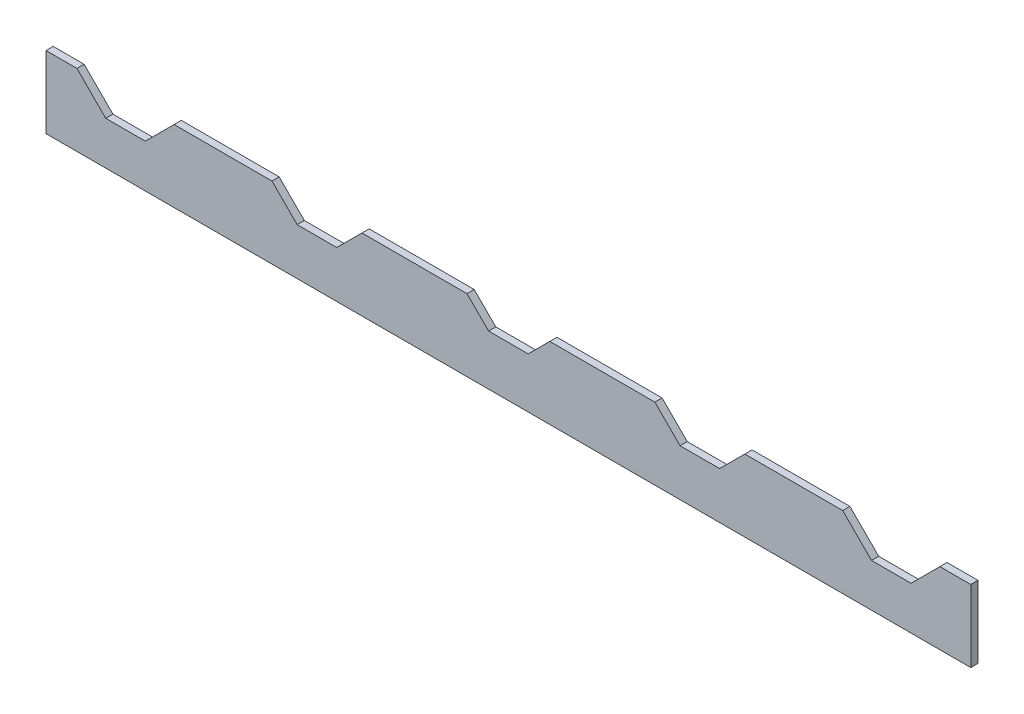
ISO-10303-21;
HEADER;
FILE_DESCRIPTION(('STEP AP214'),'2;1');
FILE_NAME('part.step','',(''),(''),'','','');
FILE_SCHEMA(('AUTOMOTIVE_DESIGN { 1 0 10303 214 1 1 1 1 }'));
ENDSEC;
DATA;
#1=APPLICATION_CONTEXT('core data for automotive mechanical design processes');
#2=APPLICATION_PROTOCOL_DEFINITION('international standard','automotive_design',2000,#1);
#3=PRODUCT_CONTEXT('',#1,'mechanical');
#4=PRODUCT('Part','Part','',(#3));
#5=PRODUCT_RELATED_PRODUCT_CATEGORY('part','',(#4));
#6=PRODUCT_DEFINITION_FORMATION('','',#4);
#7=PRODUCT_DEFINITION_CONTEXT('part definition',#1,'design');
#8=PRODUCT_DEFINITION('design','',#6,#7);
#9=PRODUCT_DEFINITION_SHAPE('','',#8);
#10=(LENGTH_UNIT() NAMED_UNIT(*) SI_UNIT(.MILLI.,.METRE.));
#11=(NAMED_UNIT(*) PLANE_ANGLE_UNIT() SI_UNIT($,.RADIAN.));
#12=(NAMED_UNIT(*) SI_UNIT($,.STERADIAN.) SOLID_ANGLE_UNIT());
#13=UNCERTAINTY_MEASURE_WITH_UNIT(LENGTH_MEASURE(1.E-05),#10,'distance_accuracy_value','');
#14=(GEOMETRIC_REPRESENTATION_CONTEXT(3) GLOBAL_UNCERTAINTY_ASSIGNED_CONTEXT((#13)) GLOBAL_UNIT_ASSIGNED_CONTEXT((#10,
#11,#12)) REPRESENTATION_CONTEXT('',''));
#15=CARTESIAN_POINT('',(0.,0.,0.));
#16=DIRECTION('',(0.,0.,1.));
#17=DIRECTION('',(1.,0.,0.));
#18=AXIS2_PLACEMENT_3D('',#15,#16,#17);
#19=CARTESIAN_POINT('',(-642.5,100.,10.));
#20=DIRECTION('',(0.,-1.,0.));
#21=DIRECTION('',(0.,0.,-1.));
#22=AXIS2_PLACEMENT_3D('',#19,#20,#21);
#23=PLANE('',#22);
#24=DIRECTION('',(0.,0.,1.));
#25=VECTOR('',#24,1.);
#26=CARTESIAN_POINT('',(328.5,100.,-0.000999999999999265));
#27=LINE('',#26,#25);
#28=CARTESIAN_POINT('',(328.5,100.,0.));
#29=VERTEX_POINT('',#28);
#30=CARTESIAN_POINT('',(328.5,100.,10.));
#31=VERTEX_POINT('',#30);
#32=EDGE_CURVE('E227',#29,#31,#27,.T.);
#33=ORIENTED_EDGE('',*,*,#32,.T.);
#34=DIRECTION('',(-1.,0.,0.));
#35=VECTOR('',#34,1.);
#36=CARTESIAN_POINT('',(-642.5,100.,10.));
#37=LINE('',#36,#35);
#38=CARTESIAN_POINT('',(464.5,100.,10.));
#39=VERTEX_POINT('',#38);
#40=EDGE_CURVE('E241',#39,#31,#37,.T.);
#41=ORIENTED_EDGE('',*,*,#40,.F.);
#42=DIRECTION('',(0.,0.,-1.));
#43=VECTOR('',#42,1.);
#44=CARTESIAN_POINT('',(464.5,100.,-0.000999999999999265));
#45=LINE('',#44,#43);
#46=CARTESIAN_POINT('',(464.5,100.,0.));
#47=VERTEX_POINT('',#46);
#48=EDGE_CURVE('E446',#39,#47,#45,.T.);
#49=ORIENTED_EDGE('',*,*,#48,.T.);
#50=DIRECTION('',(-1.,0.,0.));
#51=VECTOR('',#50,1.);
#52=CARTESIAN_POINT('',(-642.5,100.,0.));
#53=LINE('',#52,#51);
#54=EDGE_CURVE('E243',#47,#29,#53,.T.);
#55=ORIENTED_EDGE('',*,*,#54,.T.);
#56=EDGE_LOOP('',(#33,#41,#49,#55));
#57=FACE_BOUND('',#56,.T.);
#58=ADVANCED_FACE('F45',(#57),#23,.F.);
#59=DIRECTION('',(0.,0.,-1.));
#60=VECTOR('',#59,1.);
#61=CARTESIAN_POINT('',(203.5,100.,-0.000999999999999265));
#62=LINE('',#61,#60);
#63=CARTESIAN_POINT('',(203.5,100.,10.));
#64=VERTEX_POINT('',#63);
#65=CARTESIAN_POINT('',(203.5,100.,0.));
#66=VERTEX_POINT('',#65);
#67=EDGE_CURVE('E245',#64,#66,#62,.T.);
#68=ORIENTED_EDGE('',*,*,#67,.T.);
#69=CARTESIAN_POINT('',(57.4999999999999,100.,0.));
#70=VERTEX_POINT('',#69);
#71=EDGE_CURVE('E466',#66,#70,#53,.T.);
#72=ORIENTED_EDGE('',*,*,#71,.T.);
#73=DIRECTION('',(0.,0.,-1.));
#74=VECTOR('',#73,1.);
#75=CARTESIAN_POINT('',(57.4999999999999,100.,-0.000999999999999265));
#76=LINE('',#75,#74);
#77=CARTESIAN_POINT('',(57.5,100.,10.));
#78=VERTEX_POINT('',#77);
#79=EDGE_CURVE('E356',#78,#70,#76,.T.);
#80=ORIENTED_EDGE('',*,*,#79,.F.);
#81=EDGE_CURVE('E254',#64,#78,#37,.T.);
#82=ORIENTED_EDGE('',*,*,#81,.F.);
#83=EDGE_LOOP('',(#68,#72,#80,#82));
#84=FACE_BOUND('',#83,.T.);
#85=ADVANCED_FACE('F519',(#84),#23,.F.);
#86=DIRECTION('',(0.,0.,1.));
#87=VECTOR('',#86,1.);
#88=CARTESIAN_POINT('',(599.5,100.,-0.000999999999999265));
#89=LINE('',#88,#87);
#90=CARTESIAN_POINT('',(599.5,100.,0.));
#91=VERTEX_POINT('',#90);
#92=CARTESIAN_POINT('',(599.5,100.,10.));
#93=VERTEX_POINT('',#92);
#94=EDGE_CURVE('E448',#91,#93,#89,.T.);
#95=ORIENTED_EDGE('',*,*,#94,.T.);
#96=CARTESIAN_POINT('',(642.5,100.,10.));
#97=VERTEX_POINT('',#96);
#98=EDGE_CURVE('E253',#97,#93,#37,.T.);
#99=ORIENTED_EDGE('',*,*,#98,.F.);
#100=DIRECTION('',(0.,0.,-1.));
#101=VECTOR('',#100,1.);
#102=CARTESIAN_POINT('',(642.5,100.,10.));
#103=LINE('',#102,#101);
#104=CARTESIAN_POINT('',(642.5,100.,0.));
#105=VERTEX_POINT('',#104);
#106=EDGE_CURVE('E498',#97,#105,#103,.T.);
#107=ORIENTED_EDGE('',*,*,#106,.T.);
#108=EDGE_CURVE('E409',#105,#91,#53,.T.);
#109=ORIENTED_EDGE('',*,*,#108,.T.);
#110=EDGE_LOOP('',(#95,#99,#107,#109));
#111=FACE_BOUND('',#110,.T.);
#112=ADVANCED_FACE('F503',(#111),#23,.F.);
#113=CARTESIAN_POINT('',(0.,0.,10.));
#114=DIRECTION('',(0.,0.,-1.));
#115=DIRECTION('',(-1.,0.,0.));
#116=AXIS2_PLACEMENT_3D('',#113,#114,#115);
#117=PLANE('',#116);
#118=DIRECTION('',(-0.707106781186546,-0.707106781186548,0.));
#119=VECTOR('',#118,1.);
#120=CARTESIAN_POINT('',(348.5,120.,10.));
#121=LINE('',#120,#119);
#122=CARTESIAN_POINT('',(293.5,65.,10.));
#123=VERTEX_POINT('',#122);
#124=EDGE_CURVE('E224',#31,#123,#121,.T.);
#125=ORIENTED_EDGE('',*,*,#124,.T.);
#126=DIRECTION('',(-1.,0.,0.));
#127=VECTOR('',#126,1.);
#128=CARTESIAN_POINT('',(293.5,65.,10.));
#129=LINE('',#128,#127);
#130=CARTESIAN_POINT('',(238.5,65.,10.));
#131=VERTEX_POINT('',#130);
#132=EDGE_CURVE('E235',#123,#131,#129,.T.);
#133=ORIENTED_EDGE('',*,*,#132,.T.);
#134=DIRECTION('',(-0.707106781186547,0.707106781186548,0.));
#135=VECTOR('',#134,1.);
#136=CARTESIAN_POINT('',(238.5,65.,10.));
#137=LINE('',#136,#135);
#138=EDGE_CURVE('E430',#131,#64,#137,.T.);
#139=ORIENTED_EDGE('',*,*,#138,.T.);
#140=ORIENTED_EDGE('',*,*,#81,.T.);
#141=DIRECTION('',(0.707106781186547,0.707106781186548,0.));
#142=VECTOR('',#141,1.);
#143=CARTESIAN_POINT('',(27.5,70.,10.));
#144=LINE('',#143,#142);
#145=CARTESIAN_POINT('',(27.5,70.,10.));
#146=VERTEX_POINT('',#145);
#147=EDGE_CURVE('E419',#146,#78,#144,.T.);
#148=ORIENTED_EDGE('',*,*,#147,.F.);
#149=DIRECTION('',(1.,0.,0.));
#150=VECTOR('',#149,1.);
#151=CARTESIAN_POINT('',(-27.5000000000001,70.,10.));
#152=LINE('',#151,#150);
#153=CARTESIAN_POINT('',(-27.5000000000001,70.,10.));
#154=VERTEX_POINT('',#153);
#155=EDGE_CURVE('E374',#154,#146,#152,.T.);
#156=ORIENTED_EDGE('',*,*,#155,.F.);
#157=DIRECTION('',(0.707106781186546,-0.707106781186548,0.));
#158=VECTOR('',#157,1.);
#159=CARTESIAN_POINT('',(-82.4999999999999,125.,10.));
#160=LINE('',#159,#158);
#161=CARTESIAN_POINT('',(-57.5,100.,10.));
#162=VERTEX_POINT('',#161);
#163=EDGE_CURVE('E369',#162,#154,#160,.T.);
#164=ORIENTED_EDGE('',*,*,#163,.F.);
#165=CARTESIAN_POINT('',(-203.5,100.,10.));
#166=VERTEX_POINT('',#165);
#167=EDGE_CURVE('E261',#162,#166,#37,.T.);
#168=ORIENTED_EDGE('',*,*,#167,.T.);
#169=DIRECTION('',(0.707106781186547,0.707106781186548,0.));
#170=VECTOR('',#169,1.);
#171=CARTESIAN_POINT('',(-238.5,65.,10.));
#172=LINE('',#171,#170);
#173=CARTESIAN_POINT('',(-238.5,65.,10.));
#174=VERTEX_POINT('',#173);
#175=EDGE_CURVE('E381',#174,#166,#172,.T.);
#176=ORIENTED_EDGE('',*,*,#175,.F.);
#177=DIRECTION('',(1.,0.,0.));
#178=VECTOR('',#177,1.);
#179=CARTESIAN_POINT('',(-293.5,65.,10.));
#180=LINE('',#179,#178);
#181=CARTESIAN_POINT('',(-293.5,65.,10.));
#182=VERTEX_POINT('',#181);
#183=EDGE_CURVE('E325',#182,#174,#180,.T.);
#184=ORIENTED_EDGE('',*,*,#183,.F.);
#185=DIRECTION('',(0.707106781186546,-0.707106781186548,0.));
#186=VECTOR('',#185,1.);
#187=CARTESIAN_POINT('',(-348.5,120.,10.));
#188=LINE('',#187,#186);
#189=CARTESIAN_POINT('',(-328.5,100.,10.));
#190=VERTEX_POINT('',#189);
#191=EDGE_CURVE('E320',#190,#182,#188,.T.);
#192=ORIENTED_EDGE('',*,*,#191,.F.);
#193=CARTESIAN_POINT('',(-464.5,100.,10.));
#194=VERTEX_POINT('',#193);
#195=EDGE_CURVE('E267',#190,#194,#37,.T.);
#196=ORIENTED_EDGE('',*,*,#195,.T.);
#197=DIRECTION('',(0.707106781186547,0.707106781186548,0.));
#198=VECTOR('',#197,1.);
#199=CARTESIAN_POINT('',(-504.5,60.,10.));
#200=LINE('',#199,#198);
#201=CARTESIAN_POINT('',(-504.5,60.,10.));
#202=VERTEX_POINT('',#201);
#203=EDGE_CURVE('E337',#202,#194,#200,.T.);
#204=ORIENTED_EDGE('',*,*,#203,.F.);
#205=DIRECTION('',(1.,0.,0.));
#206=VECTOR('',#205,1.);
#207=CARTESIAN_POINT('',(-559.5,60.,10.));
#208=LINE('',#207,#206);
#209=CARTESIAN_POINT('',(-559.5,60.,10.));
#210=VERTEX_POINT('',#209);
#211=EDGE_CURVE('E342',#210,#202,#208,.T.);
#212=ORIENTED_EDGE('',*,*,#211,.F.);
#213=DIRECTION('',(0.707106781186546,-0.707106781186548,0.));
#214=VECTOR('',#213,1.);
#215=CARTESIAN_POINT('',(-614.5,115.,10.));
#216=LINE('',#215,#214);
#217=CARTESIAN_POINT('',(-599.5,100.,10.));
#218=VERTEX_POINT('',#217);
#219=EDGE_CURVE('E403',#218,#210,#216,.T.);
#220=ORIENTED_EDGE('',*,*,#219,.F.);
#221=CARTESIAN_POINT('',(-642.5,100.,10.));
#222=VERTEX_POINT('',#221);
#223=EDGE_CURVE('E255',#218,#222,#37,.T.);
#224=ORIENTED_EDGE('',*,*,#223,.T.);
#225=DIRECTION('',(0.,-1.,0.));
#226=VECTOR('',#225,1.);
#227=CARTESIAN_POINT('',(-642.5,0.,10.));
#228=LINE('',#227,#226);
#229=CARTESIAN_POINT('',(-642.5,0.,10.));
#230=VERTEX_POINT('',#229);
#231=EDGE_CURVE('E282',#222,#230,#228,.T.);
#232=ORIENTED_EDGE('',*,*,#231,.T.);
#233=DIRECTION('',(1.,0.,0.));
#234=VECTOR('',#233,1.);
#235=CARTESIAN_POINT('',(-642.5,0.,10.));
#236=LINE('',#235,#234);
#237=CARTESIAN_POINT('',(642.5,0.,10.));
#238=VERTEX_POINT('',#237);
#239=EDGE_CURVE('E278',#230,#238,#236,.T.);
#240=ORIENTED_EDGE('',*,*,#239,.T.);
#241=DIRECTION('',(0.,1.,0.));
#242=VECTOR('',#241,1.);
#243=CARTESIAN_POINT('',(642.5,0.,10.));
#244=LINE('',#243,#242);
#245=EDGE_CURVE('E268',#238,#97,#244,.T.);
#246=ORIENTED_EDGE('',*,*,#245,.T.);
#247=ORIENTED_EDGE('',*,*,#98,.T.);
#248=DIRECTION('',(-0.707106781186546,-0.707106781186548,0.));
#249=VECTOR('',#248,1.);
#250=CARTESIAN_POINT('',(614.5,115.,10.));
#251=LINE('',#250,#249);
#252=CARTESIAN_POINT('',(559.5,60.,10.));
#253=VERTEX_POINT('',#252);
#254=EDGE_CURVE('E295',#93,#253,#251,.T.);
#255=ORIENTED_EDGE('',*,*,#254,.T.);
#256=DIRECTION('',(-1.,0.,0.));
#257=VECTOR('',#256,1.);
#258=CARTESIAN_POINT('',(559.5,60.,10.));
#259=LINE('',#258,#257);
#260=CARTESIAN_POINT('',(504.5,60.,10.));
#261=VERTEX_POINT('',#260);
#262=EDGE_CURVE('E301',#253,#261,#259,.T.);
#263=ORIENTED_EDGE('',*,*,#262,.T.);
#264=DIRECTION('',(-0.707106781186547,0.707106781186548,0.));
#265=VECTOR('',#264,1.);
#266=CARTESIAN_POINT('',(504.5,60.,10.));
#267=LINE('',#266,#265);
#268=EDGE_CURVE('E251',#261,#39,#267,.T.);
#269=ORIENTED_EDGE('',*,*,#268,.T.);
#270=ORIENTED_EDGE('',*,*,#40,.T.);
#271=EDGE_LOOP('',(#125,#133,#139,#140,#148,#156,#164,#168,#176,#184,#192,#196,#204,#212,#220,
#224,#232,#240,#246,#247,#255,#263,#269,#270));
#272=FACE_BOUND('',#271,.T.);
#273=ADVANCED_FACE('F248',(#272),#117,.F.);
#274=CARTESIAN_POINT('',(0.,0.,0.));
#275=DIRECTION('',(0.,0.,-1.));
#276=DIRECTION('',(-1.,0.,0.));
#277=AXIS2_PLACEMENT_3D('',#274,#275,#276);
#278=PLANE('',#277);
#279=DIRECTION('',(-1.,0.,0.));
#280=VECTOR('',#279,1.);
#281=CARTESIAN_POINT('',(293.5,65.,0.));
#282=LINE('',#281,#280);
#283=CARTESIAN_POINT('',(293.5,65.,0.));
#284=VERTEX_POINT('',#283);
#285=CARTESIAN_POINT('',(238.5,65.,0.));
#286=VERTEX_POINT('',#285);
#287=EDGE_CURVE('E244',#284,#286,#282,.T.);
#288=ORIENTED_EDGE('',*,*,#287,.F.);
#289=DIRECTION('',(-0.707106781186546,-0.707106781186549,0.));
#290=VECTOR('',#289,1.);
#291=CARTESIAN_POINT('',(348.5,120.,0.));
#292=LINE('',#291,#290);
#293=EDGE_CURVE('E63',#29,#284,#292,.T.);
#294=ORIENTED_EDGE('',*,*,#293,.F.);
#295=ORIENTED_EDGE('',*,*,#54,.F.);
#296=DIRECTION('',(-0.707106781186547,0.707106781186548,0.));
#297=VECTOR('',#296,1.);
#298=CARTESIAN_POINT('',(504.5,60.,0.));
#299=LINE('',#298,#297);
#300=CARTESIAN_POINT('',(504.5,60.,0.));
#301=VERTEX_POINT('',#300);
#302=EDGE_CURVE('E306',#301,#47,#299,.T.);
#303=ORIENTED_EDGE('',*,*,#302,.F.);
#304=DIRECTION('',(-1.,0.,0.));
#305=VECTOR('',#304,1.);
#306=CARTESIAN_POINT('',(559.5,60.,0.));
#307=LINE('',#306,#305);
#308=CARTESIAN_POINT('',(559.5,60.,0.));
#309=VERTEX_POINT('',#308);
#310=EDGE_CURVE('E451',#309,#301,#307,.T.);
#311=ORIENTED_EDGE('',*,*,#310,.F.);
#312=DIRECTION('',(-0.707106781186546,-0.707106781186549,0.));
#313=VECTOR('',#312,1.);
#314=CARTESIAN_POINT('',(614.5,115.,0.));
#315=LINE('',#314,#313);
#316=EDGE_CURVE('E71',#91,#309,#315,.T.);
#317=ORIENTED_EDGE('',*,*,#316,.F.);
#318=ORIENTED_EDGE('',*,*,#108,.F.);
#319=DIRECTION('',(0.,1.,0.));
#320=VECTOR('',#319,1.);
#321=CARTESIAN_POINT('',(642.5,0.,0.));
#322=LINE('',#321,#320);
#323=CARTESIAN_POINT('',(642.5,0.,0.));
#324=VERTEX_POINT('',#323);
#325=EDGE_CURVE('E475',#324,#105,#322,.T.);
#326=ORIENTED_EDGE('',*,*,#325,.F.);
#327=DIRECTION('',(1.,0.,0.));
#328=VECTOR('',#327,1.);
#329=CARTESIAN_POINT('',(-642.5,0.,0.));
#330=LINE('',#329,#328);
#331=CARTESIAN_POINT('',(-642.5,0.,0.));
#332=VERTEX_POINT('',#331);
#333=EDGE_CURVE('E482',#332,#324,#330,.T.);
#334=ORIENTED_EDGE('',*,*,#333,.F.);
#335=DIRECTION('',(0.,-1.,0.));
#336=VECTOR('',#335,1.);
#337=CARTESIAN_POINT('',(-642.5,0.,0.));
#338=LINE('',#337,#336);
#339=CARTESIAN_POINT('',(-642.5,100.,0.));
#340=VERTEX_POINT('',#339);
#341=EDGE_CURVE('E414',#340,#332,#338,.T.);
#342=ORIENTED_EDGE('',*,*,#341,.F.);
#343=CARTESIAN_POINT('',(-599.5,100.,0.));
#344=VERTEX_POINT('',#343);
#345=EDGE_CURVE('E468',#344,#340,#53,.T.);
#346=ORIENTED_EDGE('',*,*,#345,.F.);
#347=DIRECTION('',(0.707106781186546,-0.707106781186549,0.));
#348=VECTOR('',#347,1.);
#349=CARTESIAN_POINT('',(-614.5,115.,0.));
#350=LINE('',#349,#348);
#351=CARTESIAN_POINT('',(-559.5,60.,0.));
#352=VERTEX_POINT('',#351);
#353=EDGE_CURVE('E312',#344,#352,#350,.T.);
#354=ORIENTED_EDGE('',*,*,#353,.T.);
#355=DIRECTION('',(1.,0.,0.));
#356=VECTOR('',#355,1.);
#357=CARTESIAN_POINT('',(-559.5,60.,0.));
#358=LINE('',#357,#356);
#359=CARTESIAN_POINT('',(-504.5,60.,0.));
#360=VERTEX_POINT('',#359);
#361=EDGE_CURVE('E397',#352,#360,#358,.T.);
#362=ORIENTED_EDGE('',*,*,#361,.T.);
#363=DIRECTION('',(0.707106781186547,0.707106781186548,0.));
#364=VECTOR('',#363,1.);
#365=CARTESIAN_POINT('',(-504.5,60.,0.));
#366=LINE('',#365,#364);
#367=CARTESIAN_POINT('',(-464.5,100.,0.));
#368=VERTEX_POINT('',#367);
#369=EDGE_CURVE('E401',#360,#368,#366,.T.);
#370=ORIENTED_EDGE('',*,*,#369,.T.);
#371=CARTESIAN_POINT('',(-328.5,100.,0.));
#372=VERTEX_POINT('',#371);
#373=EDGE_CURVE('E474',#372,#368,#53,.T.);
#374=ORIENTED_EDGE('',*,*,#373,.F.);
#375=DIRECTION('',(0.707106781186546,-0.707106781186549,0.));
#376=VECTOR('',#375,1.);
#377=CARTESIAN_POINT('',(-348.5,120.,0.));
#378=LINE('',#377,#376);
#379=CARTESIAN_POINT('',(-293.5,65.,0.));
#380=VERTEX_POINT('',#379);
#381=EDGE_CURVE('E357',#372,#380,#378,.T.);
#382=ORIENTED_EDGE('',*,*,#381,.T.);
#383=DIRECTION('',(1.,0.,0.));
#384=VECTOR('',#383,1.);
#385=CARTESIAN_POINT('',(-293.5,65.,0.));
#386=LINE('',#385,#384);
#387=CARTESIAN_POINT('',(-238.5,65.,0.));
#388=VERTEX_POINT('',#387);
#389=EDGE_CURVE('E314',#380,#388,#386,.T.);
#390=ORIENTED_EDGE('',*,*,#389,.T.);
#391=DIRECTION('',(0.707106781186547,0.707106781186548,0.));
#392=VECTOR('',#391,1.);
#393=CARTESIAN_POINT('',(-238.5,65.,0.));
#394=LINE('',#393,#392);
#395=CARTESIAN_POINT('',(-203.5,100.,0.));
#396=VERTEX_POINT('',#395);
#397=EDGE_CURVE('E317',#388,#396,#394,.T.);
#398=ORIENTED_EDGE('',*,*,#397,.T.);
#399=CARTESIAN_POINT('',(-57.5,100.,0.));
#400=VERTEX_POINT('',#399);
#401=EDGE_CURVE('E470',#400,#396,#53,.T.);
#402=ORIENTED_EDGE('',*,*,#401,.F.);
#403=DIRECTION('',(0.707106781186546,-0.707106781186549,0.));
#404=VECTOR('',#403,1.);
#405=CARTESIAN_POINT('',(-82.4999999999999,125.,0.));
#406=LINE('',#405,#404);
#407=CARTESIAN_POINT('',(-27.5000000000001,70.,0.));
#408=VERTEX_POINT('',#407);
#409=EDGE_CURVE('E410',#400,#408,#406,.T.);
#410=ORIENTED_EDGE('',*,*,#409,.T.);
#411=DIRECTION('',(1.,0.,0.));
#412=VECTOR('',#411,1.);
#413=CARTESIAN_POINT('',(-27.5000000000001,70.,0.));
#414=LINE('',#413,#412);
#415=CARTESIAN_POINT('',(27.5,70.,0.));
#416=VERTEX_POINT('',#415);
#417=EDGE_CURVE('E361',#408,#416,#414,.T.);
#418=ORIENTED_EDGE('',*,*,#417,.T.);
#419=DIRECTION('',(0.707106781186547,0.707106781186548,0.));
#420=VECTOR('',#419,1.);
#421=CARTESIAN_POINT('',(27.5,70.,0.));
#422=LINE('',#421,#420);
#423=EDGE_CURVE('E365',#416,#70,#422,.T.);
#424=ORIENTED_EDGE('',*,*,#423,.T.);
#425=ORIENTED_EDGE('',*,*,#71,.F.);
#426=DIRECTION('',(-0.707106781186547,0.707106781186548,0.));
#427=VECTOR('',#426,1.);
#428=CARTESIAN_POINT('',(238.5,65.,0.));
#429=LINE('',#428,#427);
#430=EDGE_CURVE('E394',#286,#66,#429,.T.);
#431=ORIENTED_EDGE('',*,*,#430,.F.);
#432=EDGE_LOOP('',(#288,#294,#295,#303,#311,#317,#318,#326,#334,#342,#346,#354,#362,#370,#374,
#382,#390,#398,#402,#410,#418,#424,#425,#431));
#433=FACE_BOUND('',#432,.T.);
#434=ADVANCED_FACE('F465',(#433),#278,.T.);
#435=ORIENTED_EDGE('',*,*,#401,.T.);
#436=DIRECTION('',(0.,0.,-1.));
#437=VECTOR('',#436,1.);
#438=CARTESIAN_POINT('',(-203.5,100.,-0.000999999999999265));
#439=LINE('',#438,#437);
#440=EDGE_CURVE('E311',#166,#396,#439,.T.);
#441=ORIENTED_EDGE('',*,*,#440,.F.);
#442=ORIENTED_EDGE('',*,*,#167,.F.);
#443=DIRECTION('',(0.,0.,1.));
#444=VECTOR('',#443,1.);
#445=CARTESIAN_POINT('',(-57.5,100.,-0.000999999999999265));
#446=LINE('',#445,#444);
#447=EDGE_CURVE('E353',#400,#162,#446,.T.);
#448=ORIENTED_EDGE('',*,*,#447,.F.);
#449=EDGE_LOOP('',(#435,#441,#442,#448));
#450=FACE_BOUND('',#449,.T.);
#451=ADVANCED_FACE('F539',(#450),#23,.F.);
#452=ORIENTED_EDGE('',*,*,#195,.F.);
#453=DIRECTION('',(0.,0.,1.));
#454=VECTOR('',#453,1.);
#455=CARTESIAN_POINT('',(-328.5,100.,-0.000999999999999265));
#456=LINE('',#455,#454);
#457=EDGE_CURVE('E309',#372,#190,#456,.T.);
#458=ORIENTED_EDGE('',*,*,#457,.F.);
#459=ORIENTED_EDGE('',*,*,#373,.T.);
#460=DIRECTION('',(0.,0.,-1.));
#461=VECTOR('',#460,1.);
#462=CARTESIAN_POINT('',(-464.5,100.,-0.000999999999999265));
#463=LINE('',#462,#461);
#464=EDGE_CURVE('E393',#194,#368,#463,.T.);
#465=ORIENTED_EDGE('',*,*,#464,.F.);
#466=EDGE_LOOP('',(#452,#458,#459,#465));
#467=FACE_BOUND('',#466,.T.);
#468=ADVANCED_FACE('F530',(#467),#23,.F.);
#469=CARTESIAN_POINT('',(-642.5,0.,10.));
#470=DIRECTION('',(1.,0.,0.));
#471=DIRECTION('',(0.,0.,-1.));
#472=AXIS2_PLACEMENT_3D('',#469,#470,#471);
#473=PLANE('',#472);
#474=ORIENTED_EDGE('',*,*,#341,.T.);
#475=DIRECTION('',(0.,0.,-1.));
#476=VECTOR('',#475,1.);
#477=CARTESIAN_POINT('',(-642.5,0.,10.));
#478=LINE('',#477,#476);
#479=EDGE_CURVE('E12',#230,#332,#478,.T.);
#480=ORIENTED_EDGE('',*,*,#479,.F.);
#481=ORIENTED_EDGE('',*,*,#231,.F.);
#482=DIRECTION('',(0.,0.,-1.));
#483=VECTOR('',#482,1.);
#484=CARTESIAN_POINT('',(-642.5,100.,10.));
#485=LINE('',#484,#483);
#486=EDGE_CURVE('E260',#222,#340,#485,.T.);
#487=ORIENTED_EDGE('',*,*,#486,.T.);
#488=EDGE_LOOP('',(#474,#480,#481,#487));
#489=FACE_BOUND('',#488,.T.);
#490=ADVANCED_FACE('F47',(#489),#473,.F.);
#491=CARTESIAN_POINT('',(-642.5,0.,10.));
#492=DIRECTION('',(0.,1.,0.));
#493=DIRECTION('',(0.,0.,1.));
#494=AXIS2_PLACEMENT_3D('',#491,#492,#493);
#495=PLANE('',#494);
#496=ORIENTED_EDGE('',*,*,#333,.T.);
#497=DIRECTION('',(0.,0.,-1.));
#498=VECTOR('',#497,1.);
#499=CARTESIAN_POINT('',(642.5,0.,10.));
#500=LINE('',#499,#498);
#501=EDGE_CURVE('E53',#238,#324,#500,.T.);
#502=ORIENTED_EDGE('',*,*,#501,.F.);
#503=ORIENTED_EDGE('',*,*,#239,.F.);
#504=ORIENTED_EDGE('',*,*,#479,.T.);
#505=EDGE_LOOP('',(#496,#502,#503,#504));
#506=FACE_BOUND('',#505,.T.);
#507=ADVANCED_FACE('F497',(#506),#495,.F.);
#508=CARTESIAN_POINT('',(642.5,0.,10.));
#509=DIRECTION('',(-1.,0.,0.));
#510=DIRECTION('',(0.,0.,1.));
#511=AXIS2_PLACEMENT_3D('',#508,#509,#510);
#512=PLANE('',#511);
#513=ORIENTED_EDGE('',*,*,#325,.T.);
#514=ORIENTED_EDGE('',*,*,#106,.F.);
#515=ORIENTED_EDGE('',*,*,#245,.F.);
#516=ORIENTED_EDGE('',*,*,#501,.T.);
#517=EDGE_LOOP('',(#513,#514,#515,#516));
#518=FACE_BOUND('',#517,.T.);
#519=ADVANCED_FACE('F499',(#518),#512,.F.);
#520=ORIENTED_EDGE('',*,*,#223,.F.);
#521=DIRECTION('',(0.,0.,1.));
#522=VECTOR('',#521,1.);
#523=CARTESIAN_POINT('',(-599.5,100.,-0.000999999999999265));
#524=LINE('',#523,#522);
#525=EDGE_CURVE('E391',#344,#218,#524,.T.);
#526=ORIENTED_EDGE('',*,*,#525,.F.);
#527=ORIENTED_EDGE('',*,*,#345,.T.);
#528=ORIENTED_EDGE('',*,*,#486,.F.);
#529=EDGE_LOOP('',(#520,#526,#527,#528));
#530=FACE_BOUND('',#529,.T.);
#531=ADVANCED_FACE('F521',(#530),#23,.F.);
#532=CARTESIAN_POINT('',(27.5,70.,-0.000999999999999265));
#533=DIRECTION('',(0.707106781186548,-0.707106781186547,0.));
#534=DIRECTION('',(0.707106781186547,0.707106781186548,0.));
#535=AXIS2_PLACEMENT_3D('',#532,#533,#534);
#536=PLANE('',#535);
#537=ORIENTED_EDGE('',*,*,#79,.T.);
#538=ORIENTED_EDGE('',*,*,#423,.F.);
#539=DIRECTION('',(0.,0.,1.));
#540=VECTOR('',#539,1.);
#541=CARTESIAN_POINT('',(27.5,70.,-0.000999999999999265));
#542=LINE('',#541,#540);
#543=EDGE_CURVE('E415',#416,#146,#542,.T.);
#544=ORIENTED_EDGE('',*,*,#543,.T.);
#545=ORIENTED_EDGE('',*,*,#147,.T.);
#546=EDGE_LOOP('',(#537,#538,#544,#545));
#547=FACE_BOUND('',#546,.T.);
#548=ADVANCED_FACE('F529',(#547),#536,.F.);
#549=CARTESIAN_POINT('',(-82.4999999999999,125.,-0.000999999999999265));
#550=DIRECTION('',(-0.707106781186549,-0.707106781186546,0.));
#551=DIRECTION('',(0.707106781186546,-0.707106781186549,0.));
#552=AXIS2_PLACEMENT_3D('',#549,#550,#551);
#553=PLANE('',#552);
#554=ORIENTED_EDGE('',*,*,#447,.T.);
#555=ORIENTED_EDGE('',*,*,#163,.T.);
#556=DIRECTION('',(0.,0.,1.));
#557=VECTOR('',#556,1.);
#558=CARTESIAN_POINT('',(-27.5000000000001,70.,-0.000999999999999265));
#559=LINE('',#558,#557);
#560=EDGE_CURVE('E416',#408,#154,#559,.T.);
#561=ORIENTED_EDGE('',*,*,#560,.F.);
#562=ORIENTED_EDGE('',*,*,#409,.F.);
#563=EDGE_LOOP('',(#554,#555,#561,#562));
#564=FACE_BOUND('',#563,.T.);
#565=ADVANCED_FACE('F535',(#564),#553,.F.);
#566=CARTESIAN_POINT('',(-27.5000000000001,70.,-0.000999999999999265));
#567=DIRECTION('',(0.,-1.,0.));
#568=DIRECTION('',(0.,0.,-1.));
#569=AXIS2_PLACEMENT_3D('',#566,#567,#568);
#570=PLANE('',#569);
#571=ORIENTED_EDGE('',*,*,#560,.T.);
#572=ORIENTED_EDGE('',*,*,#155,.T.);
#573=ORIENTED_EDGE('',*,*,#543,.F.);
#574=ORIENTED_EDGE('',*,*,#417,.F.);
#575=EDGE_LOOP('',(#571,#572,#573,#574));
#576=FACE_BOUND('',#575,.T.);
#577=ADVANCED_FACE('F575',(#576),#570,.F.);
#578=CARTESIAN_POINT('',(-504.5,60.,-0.000999999999999265));
#579=DIRECTION('',(0.707106781186548,-0.707106781186547,0.));
#580=DIRECTION('',(0.707106781186547,0.707106781186548,0.));
#581=AXIS2_PLACEMENT_3D('',#578,#579,#580);
#582=PLANE('',#581);
#583=ORIENTED_EDGE('',*,*,#464,.T.);
#584=ORIENTED_EDGE('',*,*,#369,.F.);
#585=DIRECTION('',(0.,0.,1.));
#586=VECTOR('',#585,1.);
#587=CARTESIAN_POINT('',(-504.5,60.,-0.000999999999999265));
#588=LINE('',#587,#586);
#589=EDGE_CURVE('E345',#360,#202,#588,.T.);
#590=ORIENTED_EDGE('',*,*,#589,.T.);
#591=ORIENTED_EDGE('',*,*,#203,.T.);
#592=EDGE_LOOP('',(#583,#584,#590,#591));
#593=FACE_BOUND('',#592,.T.);
#594=ADVANCED_FACE('F561',(#593),#582,.F.);
#595=CARTESIAN_POINT('',(-614.5,115.,-0.000999999999999265));
#596=DIRECTION('',(-0.707106781186549,-0.707106781186546,0.));
#597=DIRECTION('',(0.707106781186546,-0.707106781186549,0.));
#598=AXIS2_PLACEMENT_3D('',#595,#596,#597);
#599=PLANE('',#598);
#600=ORIENTED_EDGE('',*,*,#525,.T.);
#601=ORIENTED_EDGE('',*,*,#219,.T.);
#602=DIRECTION('',(0.,0.,1.));
#603=VECTOR('',#602,1.);
#604=CARTESIAN_POINT('',(-559.5,60.,-0.000999999999999265));
#605=LINE('',#604,#603);
#606=EDGE_CURVE('E341',#352,#210,#605,.T.);
#607=ORIENTED_EDGE('',*,*,#606,.F.);
#608=ORIENTED_EDGE('',*,*,#353,.F.);
#609=EDGE_LOOP('',(#600,#601,#607,#608));
#610=FACE_BOUND('',#609,.T.);
#611=ADVANCED_FACE('F599',(#610),#599,.F.);
#612=CARTESIAN_POINT('',(-559.5,60.,-0.000999999999999265));
#613=DIRECTION('',(0.,-1.,0.));
#614=DIRECTION('',(0.,0.,-1.));
#615=AXIS2_PLACEMENT_3D('',#612,#613,#614);
#616=PLANE('',#615);
#617=ORIENTED_EDGE('',*,*,#606,.T.);
#618=ORIENTED_EDGE('',*,*,#211,.T.);
#619=ORIENTED_EDGE('',*,*,#589,.F.);
#620=ORIENTED_EDGE('',*,*,#361,.F.);
#621=EDGE_LOOP('',(#617,#618,#619,#620));
#622=FACE_BOUND('',#621,.T.);
#623=ADVANCED_FACE('F564',(#622),#616,.F.);
#624=CARTESIAN_POINT('',(-238.5,65.,-0.000999999999999265));
#625=DIRECTION('',(0.707106781186548,-0.707106781186547,0.));
#626=DIRECTION('',(0.707106781186547,0.707106781186548,0.));
#627=AXIS2_PLACEMENT_3D('',#624,#625,#626);
#628=PLANE('',#627);
#629=ORIENTED_EDGE('',*,*,#440,.T.);
#630=ORIENTED_EDGE('',*,*,#397,.F.);
#631=DIRECTION('',(0.,0.,1.));
#632=VECTOR('',#631,1.);
#633=CARTESIAN_POINT('',(-238.5,65.,-0.000999999999999265));
#634=LINE('',#633,#632);
#635=EDGE_CURVE('E386',#388,#174,#634,.T.);
#636=ORIENTED_EDGE('',*,*,#635,.T.);
#637=ORIENTED_EDGE('',*,*,#175,.T.);
#638=EDGE_LOOP('',(#629,#630,#636,#637));
#639=FACE_BOUND('',#638,.T.);
#640=ADVANCED_FACE('F590',(#639),#628,.F.);
#641=CARTESIAN_POINT('',(-348.5,120.,-0.000999999999999265));
#642=DIRECTION('',(-0.707106781186549,-0.707106781186546,0.));
#643=DIRECTION('',(0.707106781186546,-0.707106781186549,0.));
#644=AXIS2_PLACEMENT_3D('',#641,#642,#643);
#645=PLANE('',#644);
#646=ORIENTED_EDGE('',*,*,#457,.T.);
#647=ORIENTED_EDGE('',*,*,#191,.T.);
#648=DIRECTION('',(0.,0.,1.));
#649=VECTOR('',#648,1.);
#650=CARTESIAN_POINT('',(-293.5,65.,-0.000999999999999265));
#651=LINE('',#650,#649);
#652=EDGE_CURVE('E385',#380,#182,#651,.T.);
#653=ORIENTED_EDGE('',*,*,#652,.F.);
#654=ORIENTED_EDGE('',*,*,#381,.F.);
#655=EDGE_LOOP('',(#646,#647,#653,#654));
#656=FACE_BOUND('',#655,.T.);
#657=ADVANCED_FACE('F513',(#656),#645,.F.);
#658=CARTESIAN_POINT('',(-293.5,65.,-0.000999999999999265));
#659=DIRECTION('',(0.,-1.,0.));
#660=DIRECTION('',(0.,0.,-1.));
#661=AXIS2_PLACEMENT_3D('',#658,#659,#660);
#662=PLANE('',#661);
#663=ORIENTED_EDGE('',*,*,#652,.T.);
#664=ORIENTED_EDGE('',*,*,#183,.T.);
#665=ORIENTED_EDGE('',*,*,#635,.F.);
#666=ORIENTED_EDGE('',*,*,#389,.F.);
#667=EDGE_LOOP('',(#663,#664,#665,#666));
#668=FACE_BOUND('',#667,.T.);
#669=ADVANCED_FACE('F506',(#668),#662,.F.);
#670=CARTESIAN_POINT('',(614.5,115.,-0.000999999999999265));
#671=DIRECTION('',(-0.707106781186549,0.707106781186546,0.));
#672=DIRECTION('',(-0.707106781186546,-0.707106781186549,0.));
#673=AXIS2_PLACEMENT_3D('',#670,#671,#672);
#674=PLANE('',#673);
#675=ORIENTED_EDGE('',*,*,#316,.T.);
#676=DIRECTION('',(0.,0.,1.));
#677=VECTOR('',#676,1.);
#678=CARTESIAN_POINT('',(559.5,60.,-0.000999999999999265));
#679=LINE('',#678,#677);
#680=EDGE_CURVE('E304',#309,#253,#679,.T.);
#681=ORIENTED_EDGE('',*,*,#680,.T.);
#682=ORIENTED_EDGE('',*,*,#254,.F.);
#683=ORIENTED_EDGE('',*,*,#94,.F.);
#684=EDGE_LOOP('',(#675,#681,#682,#683));
#685=FACE_BOUND('',#684,.T.);
#686=ADVANCED_FACE('F504',(#685),#674,.T.);
#687=CARTESIAN_POINT('',(504.5,60.,-0.000999999999999265));
#688=DIRECTION('',(0.707106781186548,0.707106781186547,0.));
#689=DIRECTION('',(-0.707106781186547,0.707106781186548,0.));
#690=AXIS2_PLACEMENT_3D('',#687,#688,#689);
#691=PLANE('',#690);
#692=ORIENTED_EDGE('',*,*,#268,.F.);
#693=DIRECTION('',(0.,0.,1.));
#694=VECTOR('',#693,1.);
#695=CARTESIAN_POINT('',(504.5,60.,-0.000999999999999265));
#696=LINE('',#695,#694);
#697=EDGE_CURVE('E300',#301,#261,#696,.T.);
#698=ORIENTED_EDGE('',*,*,#697,.F.);
#699=ORIENTED_EDGE('',*,*,#302,.T.);
#700=ORIENTED_EDGE('',*,*,#48,.F.);
#701=EDGE_LOOP('',(#692,#698,#699,#700));
#702=FACE_BOUND('',#701,.T.);
#703=ADVANCED_FACE('F462',(#702),#691,.T.);
#704=CARTESIAN_POINT('',(559.5,60.,-0.000999999999999265));
#705=DIRECTION('',(0.,1.,0.));
#706=DIRECTION('',(0.,0.,1.));
#707=AXIS2_PLACEMENT_3D('',#704,#705,#706);
#708=PLANE('',#707);
#709=ORIENTED_EDGE('',*,*,#310,.T.);
#710=ORIENTED_EDGE('',*,*,#697,.T.);
#711=ORIENTED_EDGE('',*,*,#262,.F.);
#712=ORIENTED_EDGE('',*,*,#680,.F.);
#713=EDGE_LOOP('',(#709,#710,#711,#712));
#714=FACE_BOUND('',#713,.T.);
#715=ADVANCED_FACE('F458',(#714),#708,.T.);
#716=CARTESIAN_POINT('',(348.5,120.,-0.000999999999999265));
#717=DIRECTION('',(-0.707106781186549,0.707106781186546,0.));
#718=DIRECTION('',(-0.707106781186546,-0.707106781186549,0.));
#719=AXIS2_PLACEMENT_3D('',#716,#717,#718);
#720=PLANE('',#719);
#721=ORIENTED_EDGE('',*,*,#293,.T.);
#722=DIRECTION('',(0.,0.,1.));
#723=VECTOR('',#722,1.);
#724=CARTESIAN_POINT('',(293.5,65.,-0.000999999999999265));
#725=LINE('',#724,#723);
#726=EDGE_CURVE('E228',#284,#123,#725,.T.);
#727=ORIENTED_EDGE('',*,*,#726,.T.);
#728=ORIENTED_EDGE('',*,*,#124,.F.);
#729=ORIENTED_EDGE('',*,*,#32,.F.);
#730=EDGE_LOOP('',(#721,#727,#728,#729));
#731=FACE_BOUND('',#730,.T.);
#732=ADVANCED_FACE('F226',(#731),#720,.T.);
#733=CARTESIAN_POINT('',(238.5,65.,-0.000999999999999265));
#734=DIRECTION('',(0.707106781186548,0.707106781186547,0.));
#735=DIRECTION('',(-0.707106781186547,0.707106781186548,0.));
#736=AXIS2_PLACEMENT_3D('',#733,#734,#735);
#737=PLANE('',#736);
#738=ORIENTED_EDGE('',*,*,#138,.F.);
#739=DIRECTION('',(0.,0.,1.));
#740=VECTOR('',#739,1.);
#741=CARTESIAN_POINT('',(238.5,65.,-0.000999999999999265));
#742=LINE('',#741,#740);
#743=EDGE_CURVE('E234',#286,#131,#742,.T.);
#744=ORIENTED_EDGE('',*,*,#743,.F.);
#745=ORIENTED_EDGE('',*,*,#430,.T.);
#746=ORIENTED_EDGE('',*,*,#67,.F.);
#747=EDGE_LOOP('',(#738,#744,#745,#746));
#748=FACE_BOUND('',#747,.T.);
#749=ADVANCED_FACE('F751',(#748),#737,.T.);
#750=CARTESIAN_POINT('',(293.5,65.,-0.000999999999999265));
#751=DIRECTION('',(0.,1.,0.));
#752=DIRECTION('',(0.,0.,1.));
#753=AXIS2_PLACEMENT_3D('',#750,#751,#752);
#754=PLANE('',#753);
#755=ORIENTED_EDGE('',*,*,#287,.T.);
#756=ORIENTED_EDGE('',*,*,#743,.T.);
#757=ORIENTED_EDGE('',*,*,#132,.F.);
#758=ORIENTED_EDGE('',*,*,#726,.F.);
#759=EDGE_LOOP('',(#755,#756,#757,#758));
#760=FACE_BOUND('',#759,.T.);
#761=ADVANCED_FACE('F760',(#760),#754,.T.);
#762=CLOSED_SHELL('',(#58,#85,#112,#273,#434,#451,#468,#490,#507,#519,#531,#548,#565,#577,#594,
#611,#623,#640,#657,#669,#686,#703,#715,#732,#749,#761));
#763=MANIFOLD_SOLID_BREP('B2',#762);
#764=ADVANCED_BREP_SHAPE_REPRESENTATION('',(#18,#763),#14);
#765=SHAPE_DEFINITION_REPRESENTATION(#9,#764);
ENDSEC;
END-ISO-10303-21;
